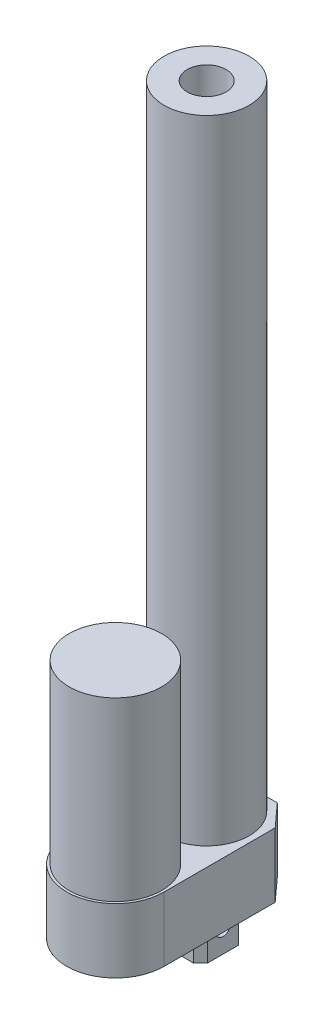
ISO-10303-21;
HEADER;
FILE_DESCRIPTION(('STEP AP214'),'2;1');
FILE_NAME('part.step','',(''),(''),'','','');
FILE_SCHEMA(('AUTOMOTIVE_DESIGN { 1 0 10303 214 1 1 1 1 }'));
ENDSEC;
DATA;
#1=APPLICATION_CONTEXT('core data for automotive mechanical design processes');
#2=APPLICATION_PROTOCOL_DEFINITION('international standard','automotive_design',2000,#1);
#3=PRODUCT_CONTEXT('',#1,'mechanical');
#4=PRODUCT('Part','Part','',(#3));
#5=PRODUCT_RELATED_PRODUCT_CATEGORY('part','',(#4));
#6=PRODUCT_DEFINITION_FORMATION('','',#4);
#7=PRODUCT_DEFINITION_CONTEXT('part definition',#1,'design');
#8=PRODUCT_DEFINITION('design','',#6,#7);
#9=PRODUCT_DEFINITION_SHAPE('','',#8);
#10=(LENGTH_UNIT() NAMED_UNIT(*) SI_UNIT(.MILLI.,.METRE.));
#11=(NAMED_UNIT(*) PLANE_ANGLE_UNIT() SI_UNIT($,.RADIAN.));
#12=(NAMED_UNIT(*) SI_UNIT($,.STERADIAN.) SOLID_ANGLE_UNIT());
#13=UNCERTAINTY_MEASURE_WITH_UNIT(LENGTH_MEASURE(1.E-05),#10,'distance_accuracy_value','');
#14=(GEOMETRIC_REPRESENTATION_CONTEXT(3) GLOBAL_UNCERTAINTY_ASSIGNED_CONTEXT((#13)) GLOBAL_UNIT_ASSIGNED_CONTEXT((#10,
#11,#12)) REPRESENTATION_CONTEXT('',''));
#15=CARTESIAN_POINT('',(0.,0.,0.));
#16=DIRECTION('',(0.,0.,1.));
#17=DIRECTION('',(1.,0.,0.));
#18=AXIS2_PLACEMENT_3D('',#15,#16,#17);
#19=CARTESIAN_POINT('',(-9.25,-9.25,-17.4999999999999));
#20=DIRECTION('',(1.,0.,0.));
#21=DIRECTION('',(0.,0.,-1.));
#22=AXIS2_PLACEMENT_3D('',#19,#20,#21);
#23=CYLINDRICAL_SURFACE('',#22,3.);
#24=CARTESIAN_POINT('',(-9.25,-9.25,-17.4999999999999));
#25=DIRECTION('',(1.,0.,0.));
#26=DIRECTION('',(0.,0.,-1.));
#27=AXIS2_PLACEMENT_3D('',#24,#25,#26);
#28=CIRCLE('',#27,3.);
#29=CARTESIAN_POINT('',(-9.25,-9.25,-20.4999999999999));
#30=VERTEX_POINT('',#29);
#31=EDGE_CURVE('E172',#30,#30,#28,.F.);
#32=ORIENTED_EDGE('',*,*,#31,.T.);
#33=EDGE_LOOP('',(#32));
#34=FACE_BOUND('',#33,.T.);
#35=CARTESIAN_POINT('',(9.25,-9.25,-17.4999999999999));
#36=DIRECTION('',(1.,0.,0.));
#37=DIRECTION('',(0.,0.,-1.));
#38=AXIS2_PLACEMENT_3D('',#35,#36,#37);
#39=CIRCLE('',#38,3.);
#40=CARTESIAN_POINT('',(9.25,-9.25,-20.4999999999999));
#41=VERTEX_POINT('',#40);
#42=EDGE_CURVE('E20',#41,#41,#39,.T.);
#43=ORIENTED_EDGE('',*,*,#42,.T.);
#44=EDGE_LOOP('',(#43));
#45=FACE_BOUND('',#44,.T.);
#46=ADVANCED_FACE('F17',(#34,#45),#23,.F.);
#47=CARTESIAN_POINT('',(0.,-18.5,0.));
#48=DIRECTION('',(0.,-1.,0.));
#49=DIRECTION('',(0.,0.,-1.));
#50=AXIS2_PLACEMENT_3D('',#47,#48,#49);
#51=PLANE('',#50);
#52=DIRECTION('',(-0.707106781186547,0.,-0.707106781186548));
#53=VECTOR('',#52,1.);
#54=CARTESIAN_POINT('',(-6.37030828551046,-18.5,-8.25));
#55=LINE('',#54,#53);
#56=CARTESIAN_POINT('',(-6.37030828551046,-18.5,-8.25));
#57=VERTEX_POINT('',#56);
#58=CARTESIAN_POINT('',(-9.25,-18.5,-11.1296917144895));
#59=VERTEX_POINT('',#58);
#60=EDGE_CURVE('E175',#57,#59,#55,.T.);
#61=ORIENTED_EDGE('',*,*,#60,.T.);
#62=DIRECTION('',(0.,0.,-1.));
#63=VECTOR('',#62,1.);
#64=CARTESIAN_POINT('',(-9.25,-18.5,-23.8703082855105));
#65=LINE('',#64,#63);
#66=CARTESIAN_POINT('',(-9.25,-18.5,-23.8703082855105));
#67=VERTEX_POINT('',#66);
#68=EDGE_CURVE('E179',#59,#67,#65,.T.);
#69=ORIENTED_EDGE('',*,*,#68,.T.);
#70=DIRECTION('',(0.707106781186551,0.,-0.707106781186544));
#71=VECTOR('',#70,1.);
#72=CARTESIAN_POINT('',(-9.25,-18.5,-23.8703082855105));
#73=LINE('',#72,#71);
#74=CARTESIAN_POINT('',(-6.37030828551044,-18.5,-26.75));
#75=VERTEX_POINT('',#74);
#76=EDGE_CURVE('E110',#67,#75,#73,.T.);
#77=ORIENTED_EDGE('',*,*,#76,.T.);
#78=DIRECTION('',(1.,0.,0.));
#79=VECTOR('',#78,1.);
#80=CARTESIAN_POINT('',(6.37030828551048,-18.5,-26.75));
#81=LINE('',#80,#79);
#82=CARTESIAN_POINT('',(6.37030828551048,-18.5,-26.75));
#83=VERTEX_POINT('',#82);
#84=EDGE_CURVE('E106',#75,#83,#81,.T.);
#85=ORIENTED_EDGE('',*,*,#84,.T.);
#86=DIRECTION('',(0.707106781186541,0.,0.707106781186554));
#87=VECTOR('',#86,1.);
#88=CARTESIAN_POINT('',(6.37030828551048,-18.5,-26.75));
#89=LINE('',#88,#87);
#90=CARTESIAN_POINT('',(9.25,-18.5,-23.8703082855104));
#91=VERTEX_POINT('',#90);
#92=EDGE_CURVE('E103',#83,#91,#89,.T.);
#93=ORIENTED_EDGE('',*,*,#92,.T.);
#94=DIRECTION('',(0.,0.,1.));
#95=VECTOR('',#94,1.);
#96=CARTESIAN_POINT('',(9.25,-18.5,-23.8703082855104));
#97=LINE('',#96,#95);
#98=CARTESIAN_POINT('',(9.25,-18.5,-11.1296917144894));
#99=VERTEX_POINT('',#98);
#100=EDGE_CURVE('E197',#91,#99,#97,.T.);
#101=ORIENTED_EDGE('',*,*,#100,.T.);
#102=DIRECTION('',(-0.707106781186551,0.,0.707106781186544));
#103=VECTOR('',#102,1.);
#104=CARTESIAN_POINT('',(9.25,-18.5,-11.1296917144894));
#105=LINE('',#104,#103);
#106=CARTESIAN_POINT('',(6.37030828551054,-18.5,-8.24999999999999));
#107=VERTEX_POINT('',#106);
#108=EDGE_CURVE('E193',#99,#107,#105,.T.);
#109=ORIENTED_EDGE('',*,*,#108,.T.);
#110=DIRECTION('',(-1.,0.,0.));
#111=VECTOR('',#110,1.);
#112=CARTESIAN_POINT('',(6.37030828551054,-18.5,-8.24999999999999));
#113=LINE('',#112,#111);
#114=EDGE_CURVE('E185',#107,#57,#113,.T.);
#115=ORIENTED_EDGE('',*,*,#114,.T.);
#116=EDGE_LOOP('',(#61,#69,#77,#85,#93,#101,#109,#115));
#117=FACE_BOUND('',#116,.T.);
#118=ADVANCED_FACE('F108',(#117),#51,.T.);
#119=CARTESIAN_POINT('',(6.37030828551048,-18.5,-26.75));
#120=DIRECTION('',(0.,0.,1.));
#121=DIRECTION('',(1.,0.,0.));
#122=AXIS2_PLACEMENT_3D('',#119,#120,#121);
#123=PLANE('',#122);
#124=DIRECTION('',(0.,1.,0.));
#125=VECTOR('',#124,1.);
#126=CARTESIAN_POINT('',(6.37030828551048,-18.5,-26.75));
#127=LINE('',#126,#125);
#128=CARTESIAN_POINT('',(6.37030828551048,0.,-26.75));
#129=VERTEX_POINT('',#128);
#130=EDGE_CURVE('E114',#129,#83,#127,.F.);
#131=ORIENTED_EDGE('',*,*,#130,.T.);
#132=ORIENTED_EDGE('',*,*,#84,.F.);
#133=DIRECTION('',(0.,1.,0.));
#134=VECTOR('',#133,1.);
#135=CARTESIAN_POINT('',(-6.37030828551044,-18.5,-26.75));
#136=LINE('',#135,#134);
#137=CARTESIAN_POINT('',(-6.37030828551044,0.,-26.75));
#138=VERTEX_POINT('',#137);
#139=EDGE_CURVE('E241',#75,#138,#136,.T.);
#140=ORIENTED_EDGE('',*,*,#139,.T.);
#141=DIRECTION('',(1.,0.,0.));
#142=VECTOR('',#141,1.);
#143=CARTESIAN_POINT('',(0.,0.,-26.75));
#144=LINE('',#143,#142);
#145=EDGE_CURVE('E121',#138,#129,#144,.T.);
#146=ORIENTED_EDGE('',*,*,#145,.T.);
#147=EDGE_LOOP('',(#131,#132,#140,#146));
#148=FACE_BOUND('',#147,.T.);
#149=ADVANCED_FACE('F118',(#148),#123,.F.);
#150=CARTESIAN_POINT('',(6.37030828551048,-18.5,-26.75));
#151=DIRECTION('',(-0.707106781186554,0.,0.707106781186541));
#152=DIRECTION('',(0.707106781186541,0.,0.707106781186554));
#153=AXIS2_PLACEMENT_3D('',#150,#151,#152);
#154=PLANE('',#153);
#155=DIRECTION('',(0.,1.,0.));
#156=VECTOR('',#155,1.);
#157=CARTESIAN_POINT('',(9.25,-18.5,-23.8703082855104));
#158=LINE('',#157,#156);
#159=CARTESIAN_POINT('',(9.25,0.,-23.8703082855104));
#160=VERTEX_POINT('',#159);
#161=EDGE_CURVE('E128',#160,#91,#158,.F.);
#162=ORIENTED_EDGE('',*,*,#161,.T.);
#163=ORIENTED_EDGE('',*,*,#92,.F.);
#164=ORIENTED_EDGE('',*,*,#130,.F.);
#165=DIRECTION('',(0.707106781186541,0.,0.707106781186553));
#166=VECTOR('',#165,1.);
#167=CARTESIAN_POINT('',(6.37030828551047,0.,-26.75));
#168=LINE('',#167,#166);
#169=EDGE_CURVE('E265',#129,#160,#168,.T.);
#170=ORIENTED_EDGE('',*,*,#169,.T.);
#171=EDGE_LOOP('',(#162,#163,#164,#170));
#172=FACE_BOUND('',#171,.T.);
#173=ADVANCED_FACE('F126',(#172),#154,.F.);
#174=CARTESIAN_POINT('',(9.25,-18.5,-23.8703082855104));
#175=DIRECTION('',(-1.,0.,0.));
#176=DIRECTION('',(0.,0.,1.));
#177=AXIS2_PLACEMENT_3D('',#174,#175,#176);
#178=PLANE('',#177);
#179=DIRECTION('',(0.,1.,0.));
#180=VECTOR('',#179,1.);
#181=CARTESIAN_POINT('',(9.25,-18.5,-11.1296917144894));
#182=LINE('',#181,#180);
#183=CARTESIAN_POINT('',(9.25,0.,-11.1296917144894));
#184=VERTEX_POINT('',#183);
#185=EDGE_CURVE('E195',#184,#99,#182,.F.);
#186=ORIENTED_EDGE('',*,*,#185,.T.);
#187=ORIENTED_EDGE('',*,*,#100,.F.);
#188=ORIENTED_EDGE('',*,*,#161,.F.);
#189=DIRECTION('',(0.,0.,1.));
#190=VECTOR('',#189,1.);
#191=CARTESIAN_POINT('',(9.25,0.,17.5));
#192=LINE('',#191,#190);
#193=EDGE_CURVE('E206',#160,#184,#192,.T.);
#194=ORIENTED_EDGE('',*,*,#193,.T.);
#195=EDGE_LOOP('',(#186,#187,#188,#194));
#196=FACE_BOUND('',#195,.T.);
#197=ORIENTED_EDGE('',*,*,#42,.F.);
#198=EDGE_LOOP('',(#197));
#199=FACE_BOUND('',#198,.T.);
#200=ADVANCED_FACE('F202',(#196,#199),#178,.F.);
#201=CARTESIAN_POINT('',(9.25,-18.5,-11.1296917144894));
#202=DIRECTION('',(-0.707106781186544,0.,-0.707106781186551));
#203=DIRECTION('',(-0.707106781186551,0.,0.707106781186544));
#204=AXIS2_PLACEMENT_3D('',#201,#202,#203);
#205=PLANE('',#204);
#206=DIRECTION('',(0.,1.,0.));
#207=VECTOR('',#206,1.);
#208=CARTESIAN_POINT('',(6.37030828551054,-18.5,-8.24999999999999));
#209=LINE('',#208,#207);
#210=CARTESIAN_POINT('',(6.37030828551054,0.,-8.24999999999999));
#211=VERTEX_POINT('',#210);
#212=EDGE_CURVE('E190',#211,#107,#209,.F.);
#213=ORIENTED_EDGE('',*,*,#212,.T.);
#214=ORIENTED_EDGE('',*,*,#108,.F.);
#215=ORIENTED_EDGE('',*,*,#185,.F.);
#216=DIRECTION('',(-0.707106781186552,0.,0.707106781186543));
#217=VECTOR('',#216,1.);
#218=CARTESIAN_POINT('',(9.25,0.,-11.1296917144894));
#219=LINE('',#218,#217);
#220=EDGE_CURVE('E214',#184,#211,#219,.T.);
#221=ORIENTED_EDGE('',*,*,#220,.T.);
#222=EDGE_LOOP('',(#213,#214,#215,#221));
#223=FACE_BOUND('',#222,.T.);
#224=ADVANCED_FACE('F210',(#223),#205,.F.);
#225=CARTESIAN_POINT('',(6.37030828551054,-18.5,-8.24999999999999));
#226=DIRECTION('',(0.,0.,-1.));
#227=DIRECTION('',(-1.,0.,0.));
#228=AXIS2_PLACEMENT_3D('',#225,#226,#227);
#229=PLANE('',#228);
#230=DIRECTION('',(0.,1.,0.));
#231=VECTOR('',#230,1.);
#232=CARTESIAN_POINT('',(-6.37030828551046,-18.5,-8.25));
#233=LINE('',#232,#231);
#234=CARTESIAN_POINT('',(-6.37030828551046,0.,-8.25));
#235=VERTEX_POINT('',#234);
#236=EDGE_CURVE('E181',#235,#57,#233,.F.);
#237=ORIENTED_EDGE('',*,*,#236,.T.);
#238=ORIENTED_EDGE('',*,*,#114,.F.);
#239=ORIENTED_EDGE('',*,*,#212,.F.);
#240=DIRECTION('',(1.,0.,0.));
#241=VECTOR('',#240,1.);
#242=CARTESIAN_POINT('',(0.,0.,-8.24999999999999));
#243=LINE('',#242,#241);
#244=EDGE_CURVE('E221',#211,#235,#243,.F.);
#245=ORIENTED_EDGE('',*,*,#244,.T.);
#246=EDGE_LOOP('',(#237,#238,#239,#245));
#247=FACE_BOUND('',#246,.T.);
#248=ADVANCED_FACE('F218',(#247),#229,.F.);
#249=CARTESIAN_POINT('',(-6.37030828551046,-18.5,-8.25));
#250=DIRECTION('',(0.707106781186548,0.,-0.707106781186547));
#251=DIRECTION('',(-0.707106781186547,0.,-0.707106781186548));
#252=AXIS2_PLACEMENT_3D('',#249,#250,#251);
#253=PLANE('',#252);
#254=DIRECTION('',(0.,1.,0.));
#255=VECTOR('',#254,1.);
#256=CARTESIAN_POINT('',(-9.25,-18.5,-11.1296917144895));
#257=LINE('',#256,#255);
#258=CARTESIAN_POINT('',(-9.25,0.,-11.1296917144895));
#259=VERTEX_POINT('',#258);
#260=EDGE_CURVE('E174',#259,#59,#257,.F.);
#261=ORIENTED_EDGE('',*,*,#260,.T.);
#262=ORIENTED_EDGE('',*,*,#60,.F.);
#263=ORIENTED_EDGE('',*,*,#236,.F.);
#264=DIRECTION('',(-0.707106781186547,0.,-0.707106781186548));
#265=VECTOR('',#264,1.);
#266=CARTESIAN_POINT('',(-6.37030828551046,0.,-8.25));
#267=LINE('',#266,#265);
#268=EDGE_CURVE('E229',#235,#259,#267,.T.);
#269=ORIENTED_EDGE('',*,*,#268,.T.);
#270=EDGE_LOOP('',(#261,#262,#263,#269));
#271=FACE_BOUND('',#270,.T.);
#272=ADVANCED_FACE('F225',(#271),#253,.F.);
#273=CARTESIAN_POINT('',(-9.25,-18.5,-23.8703082855105));
#274=DIRECTION('',(1.,0.,0.));
#275=DIRECTION('',(0.,0.,-1.));
#276=AXIS2_PLACEMENT_3D('',#273,#274,#275);
#277=PLANE('',#276);
#278=DIRECTION('',(0.,1.,0.));
#279=VECTOR('',#278,1.);
#280=CARTESIAN_POINT('',(-9.25,-18.5,-23.8703082855105));
#281=LINE('',#280,#279);
#282=CARTESIAN_POINT('',(-9.25,0.,-23.8703082855105));
#283=VERTEX_POINT('',#282);
#284=EDGE_CURVE('E237',#283,#67,#281,.F.);
#285=ORIENTED_EDGE('',*,*,#284,.T.);
#286=ORIENTED_EDGE('',*,*,#68,.F.);
#287=ORIENTED_EDGE('',*,*,#260,.F.);
#288=DIRECTION('',(0.,0.,1.));
#289=VECTOR('',#288,1.);
#290=CARTESIAN_POINT('',(-9.25,0.,17.5));
#291=LINE('',#290,#289);
#292=EDGE_CURVE('E271',#259,#283,#291,.F.);
#293=ORIENTED_EDGE('',*,*,#292,.T.);
#294=EDGE_LOOP('',(#285,#286,#287,#293));
#295=FACE_BOUND('',#294,.T.);
#296=ORIENTED_EDGE('',*,*,#31,.F.);
#297=EDGE_LOOP('',(#296));
#298=FACE_BOUND('',#297,.T.);
#299=ADVANCED_FACE('F234',(#295,#298),#277,.F.);
#300=CARTESIAN_POINT('',(-9.25,-18.5,-23.8703082855105));
#301=DIRECTION('',(0.707106781186544,0.,0.707106781186551));
#302=DIRECTION('',(0.707106781186551,0.,-0.707106781186544));
#303=AXIS2_PLACEMENT_3D('',#300,#301,#302);
#304=PLANE('',#303);
#305=ORIENTED_EDGE('',*,*,#139,.F.);
#306=ORIENTED_EDGE('',*,*,#76,.F.);
#307=ORIENTED_EDGE('',*,*,#284,.F.);
#308=DIRECTION('',(0.707106781186551,0.,-0.707106781186544));
#309=VECTOR('',#308,1.);
#310=CARTESIAN_POINT('',(-9.25,0.,-23.8703082855105));
#311=LINE('',#310,#309);
#312=EDGE_CURVE('E171',#283,#138,#311,.T.);
#313=ORIENTED_EDGE('',*,*,#312,.T.);
#314=EDGE_LOOP('',(#305,#306,#307,#313));
#315=FACE_BOUND('',#314,.T.);
#316=ADVANCED_FACE('F336',(#315),#304,.F.);
#317=CARTESIAN_POINT('',(0.,86.5,-20.));
#318=DIRECTION('',(0.,1.,0.));
#319=DIRECTION('',(0.,0.,1.));
#320=AXIS2_PLACEMENT_3D('',#317,#318,#319);
#321=PLANE('',#320);
#322=CARTESIAN_POINT('',(0.,86.5,-20.));
#323=DIRECTION('',(0.,1.,0.));
#324=DIRECTION('',(0.,0.,1.));
#325=AXIS2_PLACEMENT_3D('',#322,#323,#324);
#326=CIRCLE('',#325,8.);
#327=CARTESIAN_POINT('',(0.,86.5,-12.));
#328=VERTEX_POINT('',#327);
#329=EDGE_CURVE('E169',#328,#328,#326,.T.);
#330=ORIENTED_EDGE('',*,*,#329,.T.);
#331=EDGE_LOOP('',(#330));
#332=FACE_BOUND('',#331,.T.);
#333=ADVANCED_FACE('F327',(#332),#321,.T.);
#334=CARTESIAN_POINT('',(0.,99.,17.5));
#335=DIRECTION('',(0.,1.,0.));
#336=DIRECTION('',(0.,0.,1.));
#337=AXIS2_PLACEMENT_3D('',#334,#335,#336);
#338=PLANE('',#337);
#339=CARTESIAN_POINT('',(0.,99.,17.5));
#340=DIRECTION('',(0.,-1.,0.));
#341=DIRECTION('',(0.,0.,-1.));
#342=AXIS2_PLACEMENT_3D('',#339,#340,#341);
#343=CIRCLE('',#342,19.);
#344=CARTESIAN_POINT('',(0.,99.,-1.5));
#345=VERTEX_POINT('',#344);
#346=EDGE_CURVE('E165',#345,#345,#343,.T.);
#347=ORIENTED_EDGE('',*,*,#346,.F.);
#348=EDGE_LOOP('',(#347));
#349=FACE_BOUND('',#348,.T.);
#350=ADVANCED_FACE('F325',(#349),#338,.T.);
#351=CARTESIAN_POINT('',(0.,0.,17.5));
#352=DIRECTION('',(0.,1.,0.));
#353=DIRECTION('',(0.,0.,1.));
#354=AXIS2_PLACEMENT_3D('',#351,#352,#353);
#355=PLANE('',#354);
#356=ORIENTED_EDGE('',*,*,#292,.F.);
#357=ORIENTED_EDGE('',*,*,#268,.F.);
#358=ORIENTED_EDGE('',*,*,#244,.F.);
#359=ORIENTED_EDGE('',*,*,#220,.F.);
#360=ORIENTED_EDGE('',*,*,#193,.F.);
#361=ORIENTED_EDGE('',*,*,#169,.F.);
#362=ORIENTED_EDGE('',*,*,#145,.F.);
#363=ORIENTED_EDGE('',*,*,#312,.F.);
#364=EDGE_LOOP('',(#356,#357,#358,#359,#360,#361,#362,#363));
#365=FACE_BOUND('',#364,.T.);
#366=DIRECTION('',(1.,0.,0.));
#367=VECTOR('',#366,1.);
#368=CARTESIAN_POINT('',(11.5432004168341,0.,-37.5));
#369=LINE('',#368,#367);
#370=CARTESIAN_POINT('',(-11.5432004168341,0.,-37.5));
#371=VERTEX_POINT('',#370);
#372=CARTESIAN_POINT('',(11.5432004168341,0.,-37.5));
#373=VERTEX_POINT('',#372);
#374=EDGE_CURVE('E168',#371,#373,#369,.T.);
#375=ORIENTED_EDGE('',*,*,#374,.T.);
#376=DIRECTION('',(0.671598777527421,0.,0.740915030231992));
#377=VECTOR('',#376,1.);
#378=CARTESIAN_POINT('',(20.,0.,-28.1703672959389));
#379=LINE('',#378,#377);
#380=CARTESIAN_POINT('',(20.,0.,-28.1703672959389));
#381=VERTEX_POINT('',#380);
#382=EDGE_CURVE('E161',#373,#381,#379,.T.);
#383=ORIENTED_EDGE('',*,*,#382,.T.);
#384=DIRECTION('',(0.,0.,1.));
#385=VECTOR('',#384,1.);
#386=CARTESIAN_POINT('',(20.,0.,17.5));
#387=LINE('',#386,#385);
#388=CARTESIAN_POINT('',(20.,0.,17.5));
#389=VERTEX_POINT('',#388);
#390=EDGE_CURVE('E253',#381,#389,#387,.T.);
#391=ORIENTED_EDGE('',*,*,#390,.T.);
#392=CARTESIAN_POINT('',(0.,0.,17.5));
#393=DIRECTION('',(0.,-1.,0.));
#394=DIRECTION('',(0.,0.,-1.));
#395=AXIS2_PLACEMENT_3D('',#392,#393,#394);
#396=CIRCLE('',#395,20.);
#397=CARTESIAN_POINT('',(-20.,0.,17.5));
#398=VERTEX_POINT('',#397);
#399=EDGE_CURVE('E62',#398,#389,#396,.F.);
#400=ORIENTED_EDGE('',*,*,#399,.F.);
#401=DIRECTION('',(0.,0.,-1.));
#402=VECTOR('',#401,1.);
#403=CARTESIAN_POINT('',(-20.,0.,17.5));
#404=LINE('',#403,#402);
#405=CARTESIAN_POINT('',(-20.,0.,-28.1703672959389));
#406=VERTEX_POINT('',#405);
#407=EDGE_CURVE('E164',#398,#406,#404,.T.);
#408=ORIENTED_EDGE('',*,*,#407,.T.);
#409=DIRECTION('',(0.671598777527421,0.,-0.740915030231992));
#410=VECTOR('',#409,1.);
#411=CARTESIAN_POINT('',(-20.,0.,-28.1703672959389));
#412=LINE('',#411,#410);
#413=EDGE_CURVE('E71',#406,#371,#412,.T.);
#414=ORIENTED_EDGE('',*,*,#413,.T.);
#415=EDGE_LOOP('',(#375,#383,#391,#400,#408,#414));
#416=FACE_BOUND('',#415,.T.);
#417=ADVANCED_FACE('F296',(#365,#416),#355,.F.);
#418=CARTESIAN_POINT('',(0.,86.5,-20.));
#419=DIRECTION('',(0.,1.,0.));
#420=DIRECTION('',(0.,0.,1.));
#421=AXIS2_PLACEMENT_3D('',#418,#419,#420);
#422=CYLINDRICAL_SURFACE('',#421,8.);
#423=CARTESIAN_POINT('',(0.,286.5,-20.));
#424=DIRECTION('',(0.,1.,0.));
#425=DIRECTION('',(0.,0.,1.));
#426=AXIS2_PLACEMENT_3D('',#423,#424,#425);
#427=CIRCLE('',#426,8.);
#428=CARTESIAN_POINT('',(0.,286.5,-12.));
#429=VERTEX_POINT('',#428);
#430=EDGE_CURVE('E158',#429,#429,#427,.F.);
#431=ORIENTED_EDGE('',*,*,#430,.F.);
#432=EDGE_LOOP('',(#431));
#433=FACE_BOUND('',#432,.T.);
#434=ORIENTED_EDGE('',*,*,#329,.F.);
#435=EDGE_LOOP('',(#434));
#436=FACE_BOUND('',#435,.T.);
#437=ADVANCED_FACE('F321',(#433,#436),#422,.F.);
#438=CARTESIAN_POINT('',(0.,99.,17.5));
#439=DIRECTION('',(0.,-1.,0.));
#440=DIRECTION('',(0.,0.,-1.));
#441=AXIS2_PLACEMENT_3D('',#438,#439,#440);
#442=CYLINDRICAL_SURFACE('',#441,19.);
#443=CARTESIAN_POINT('',(0.,26.5,17.5));
#444=DIRECTION('',(0.,-1.,0.));
#445=DIRECTION('',(0.,0.,-1.));
#446=AXIS2_PLACEMENT_3D('',#443,#444,#445);
#447=CIRCLE('',#446,19.);
#448=CARTESIAN_POINT('',(0.,26.5,-1.5));
#449=VERTEX_POINT('',#448);
#450=EDGE_CURVE('E155',#449,#449,#447,.T.);
#451=ORIENTED_EDGE('',*,*,#450,.F.);
#452=EDGE_LOOP('',(#451));
#453=FACE_BOUND('',#452,.T.);
#454=ORIENTED_EDGE('',*,*,#346,.T.);
#455=EDGE_LOOP('',(#454));
#456=FACE_BOUND('',#455,.T.);
#457=ADVANCED_FACE('F318',(#453,#456),#442,.T.);
#458=CARTESIAN_POINT('',(11.5432004168341,26.5,-37.5));
#459=DIRECTION('',(0.,0.,1.));
#460=DIRECTION('',(1.,0.,0.));
#461=AXIS2_PLACEMENT_3D('',#458,#459,#460);
#462=PLANE('',#461);
#463=DIRECTION('',(0.,1.,0.));
#464=VECTOR('',#463,1.);
#465=CARTESIAN_POINT('',(-11.5432004168341,26.5,-37.5));
#466=LINE('',#465,#464);
#467=CARTESIAN_POINT('',(-11.5432004168341,26.5,-37.5));
#468=VERTEX_POINT('',#467);
#469=EDGE_CURVE('E247',#371,#468,#466,.T.);
#470=ORIENTED_EDGE('',*,*,#469,.T.);
#471=DIRECTION('',(1.,0.,0.));
#472=VECTOR('',#471,1.);
#473=CARTESIAN_POINT('',(0.,26.5,-37.5));
#474=LINE('',#473,#472);
#475=CARTESIAN_POINT('',(11.5432004168341,26.5,-37.5));
#476=VERTEX_POINT('',#475);
#477=EDGE_CURVE('E152',#476,#468,#474,.F.);
#478=ORIENTED_EDGE('',*,*,#477,.F.);
#479=DIRECTION('',(0.,1.,0.));
#480=VECTOR('',#479,1.);
#481=CARTESIAN_POINT('',(11.5432004168341,26.5,-37.5));
#482=LINE('',#481,#480);
#483=EDGE_CURVE('E260',#476,#373,#482,.F.);
#484=ORIENTED_EDGE('',*,*,#483,.T.);
#485=ORIENTED_EDGE('',*,*,#374,.F.);
#486=EDGE_LOOP('',(#470,#478,#484,#485));
#487=FACE_BOUND('',#486,.T.);
#488=ADVANCED_FACE('F293',(#487),#462,.F.);
#489=CARTESIAN_POINT('',(-20.,26.5,-28.1703672959389));
#490=DIRECTION('',(0.740915030231992,0.,0.671598777527421));
#491=DIRECTION('',(0.671598777527421,0.,-0.740915030231992));
#492=AXIS2_PLACEMENT_3D('',#489,#490,#491);
#493=PLANE('',#492);
#494=DIRECTION('',(0.,1.,0.));
#495=VECTOR('',#494,1.);
#496=CARTESIAN_POINT('',(-20.,26.5,-28.1703672959389));
#497=LINE('',#496,#495);
#498=CARTESIAN_POINT('',(-20.,26.5,-28.1703672959389));
#499=VERTEX_POINT('',#498);
#500=EDGE_CURVE('E246',#406,#499,#497,.T.);
#501=ORIENTED_EDGE('',*,*,#500,.T.);
#502=DIRECTION('',(-0.671598777527421,0.,0.740915030231992));
#503=VECTOR('',#502,1.);
#504=CARTESIAN_POINT('',(-11.5432004168341,26.5,-37.5));
#505=LINE('',#504,#503);
#506=EDGE_CURVE('E149',#468,#499,#505,.T.);
#507=ORIENTED_EDGE('',*,*,#506,.F.);
#508=ORIENTED_EDGE('',*,*,#469,.F.);
#509=ORIENTED_EDGE('',*,*,#413,.F.);
#510=EDGE_LOOP('',(#501,#507,#508,#509));
#511=FACE_BOUND('',#510,.T.);
#512=ADVANCED_FACE('F307',(#511),#493,.F.);
#513=CARTESIAN_POINT('',(-20.,26.5,17.5));
#514=DIRECTION('',(1.,0.,0.));
#515=DIRECTION('',(0.,0.,-1.));
#516=AXIS2_PLACEMENT_3D('',#513,#514,#515);
#517=PLANE('',#516);
#518=DIRECTION('',(0.,-1.,0.));
#519=VECTOR('',#518,1.);
#520=CARTESIAN_POINT('',(-20.,26.5,17.5));
#521=LINE('',#520,#519);
#522=CARTESIAN_POINT('',(-20.,26.5,17.5));
#523=VERTEX_POINT('',#522);
#524=EDGE_CURVE('E163',#523,#398,#521,.T.);
#525=ORIENTED_EDGE('',*,*,#524,.F.);
#526=DIRECTION('',(0.,0.,1.));
#527=VECTOR('',#526,1.);
#528=CARTESIAN_POINT('',(-20.,26.5,17.5));
#529=LINE('',#528,#527);
#530=EDGE_CURVE('E146',#499,#523,#529,.T.);
#531=ORIENTED_EDGE('',*,*,#530,.F.);
#532=ORIENTED_EDGE('',*,*,#500,.F.);
#533=ORIENTED_EDGE('',*,*,#407,.F.);
#534=EDGE_LOOP('',(#525,#531,#532,#533));
#535=FACE_BOUND('',#534,.T.);
#536=ADVANCED_FACE('F304',(#535),#517,.F.);
#537=CARTESIAN_POINT('',(0.,26.5,17.5));
#538=DIRECTION('',(0.,-1.,0.));
#539=DIRECTION('',(0.,0.,-1.));
#540=AXIS2_PLACEMENT_3D('',#537,#538,#539);
#541=CYLINDRICAL_SURFACE('',#540,20.);
#542=CARTESIAN_POINT('',(0.,26.5,17.5));
#543=DIRECTION('',(0.,-1.,0.));
#544=DIRECTION('',(0.,0.,-1.));
#545=AXIS2_PLACEMENT_3D('',#542,#543,#544);
#546=CIRCLE('',#545,20.);
#547=CARTESIAN_POINT('',(20.,26.5,17.5));
#548=VERTEX_POINT('',#547);
#549=EDGE_CURVE('E143',#523,#548,#546,.F.);
#550=ORIENTED_EDGE('',*,*,#549,.F.);
#551=ORIENTED_EDGE('',*,*,#524,.T.);
#552=ORIENTED_EDGE('',*,*,#399,.T.);
#553=DIRECTION('',(0.,1.,0.));
#554=VECTOR('',#553,1.);
#555=CARTESIAN_POINT('',(20.,26.5,17.5));
#556=LINE('',#555,#554);
#557=EDGE_CURVE('E255',#389,#548,#556,.T.);
#558=ORIENTED_EDGE('',*,*,#557,.T.);
#559=EDGE_LOOP('',(#550,#551,#552,#558));
#560=FACE_BOUND('',#559,.T.);
#561=ADVANCED_FACE('F301',(#560),#541,.T.);
#562=CARTESIAN_POINT('',(20.,26.5,17.5));
#563=DIRECTION('',(-1.,0.,0.));
#564=DIRECTION('',(0.,0.,1.));
#565=AXIS2_PLACEMENT_3D('',#562,#563,#564);
#566=PLANE('',#565);
#567=DIRECTION('',(0.,1.,0.));
#568=VECTOR('',#567,1.);
#569=CARTESIAN_POINT('',(20.,26.5,-28.1703672959389));
#570=LINE('',#569,#568);
#571=CARTESIAN_POINT('',(20.,26.5,-28.1703672959389));
#572=VERTEX_POINT('',#571);
#573=EDGE_CURVE('E35',#381,#572,#570,.T.);
#574=ORIENTED_EDGE('',*,*,#573,.T.);
#575=DIRECTION('',(0.,0.,1.));
#576=VECTOR('',#575,1.);
#577=CARTESIAN_POINT('',(20.,26.5,17.5));
#578=LINE('',#577,#576);
#579=EDGE_CURVE('E140',#548,#572,#578,.F.);
#580=ORIENTED_EDGE('',*,*,#579,.F.);
#581=ORIENTED_EDGE('',*,*,#557,.F.);
#582=ORIENTED_EDGE('',*,*,#390,.F.);
#583=EDGE_LOOP('',(#574,#580,#581,#582));
#584=FACE_BOUND('',#583,.T.);
#585=ADVANCED_FACE('F298',(#584),#566,.F.);
#586=CARTESIAN_POINT('',(20.,26.5,-28.1703672959389));
#587=DIRECTION('',(-0.740915030231992,0.,0.671598777527421));
#588=DIRECTION('',(0.671598777527421,0.,0.740915030231992));
#589=AXIS2_PLACEMENT_3D('',#586,#587,#588);
#590=PLANE('',#589);
#591=ORIENTED_EDGE('',*,*,#483,.F.);
#592=DIRECTION('',(-0.671598777527421,0.,-0.740915030231992));
#593=VECTOR('',#592,1.);
#594=CARTESIAN_POINT('',(20.,26.5,-28.1703672959389));
#595=LINE('',#594,#593);
#596=EDGE_CURVE('E137',#572,#476,#595,.T.);
#597=ORIENTED_EDGE('',*,*,#596,.F.);
#598=ORIENTED_EDGE('',*,*,#573,.F.);
#599=ORIENTED_EDGE('',*,*,#382,.F.);
#600=EDGE_LOOP('',(#591,#597,#598,#599));
#601=FACE_BOUND('',#600,.T.);
#602=ADVANCED_FACE('F295',(#601),#590,.F.);
#603=CARTESIAN_POINT('',(0.,286.5,-20.));
#604=DIRECTION('',(0.,1.,0.));
#605=DIRECTION('',(0.,0.,1.));
#606=AXIS2_PLACEMENT_3D('',#603,#604,#605);
#607=PLANE('',#606);
#608=CARTESIAN_POINT('',(0.,286.5,-20.));
#609=DIRECTION('',(0.,-1.,0.));
#610=DIRECTION('',(0.,0.,-1.));
#611=AXIS2_PLACEMENT_3D('',#608,#609,#610);
#612=CIRCLE('',#611,17.5);
#613=CARTESIAN_POINT('',(0.,286.5,-37.5));
#614=VERTEX_POINT('',#613);
#615=EDGE_CURVE('E26',#614,#614,#612,.T.);
#616=ORIENTED_EDGE('',*,*,#615,.F.);
#617=EDGE_LOOP('',(#616));
#618=FACE_BOUND('',#617,.T.);
#619=ORIENTED_EDGE('',*,*,#430,.T.);
#620=EDGE_LOOP('',(#619));
#621=FACE_BOUND('',#620,.T.);
#622=ADVANCED_FACE('F313',(#618,#621),#607,.T.);
#623=CARTESIAN_POINT('',(0.,26.5,17.5));
#624=DIRECTION('',(0.,1.,0.));
#625=DIRECTION('',(0.,0.,1.));
#626=AXIS2_PLACEMENT_3D('',#623,#624,#625);
#627=PLANE('',#626);
#628=CARTESIAN_POINT('',(0.,26.5,-20.));
#629=DIRECTION('',(0.,-1.,0.));
#630=DIRECTION('',(0.,0.,-1.));
#631=AXIS2_PLACEMENT_3D('',#628,#629,#630);
#632=CIRCLE('',#631,17.5);
#633=CARTESIAN_POINT('',(0.,26.5,-37.5));
#634=VERTEX_POINT('',#633);
#635=EDGE_CURVE('E11',#634,#634,#632,.F.);
#636=ORIENTED_EDGE('',*,*,#635,.F.);
#637=EDGE_LOOP('',(#636));
#638=FACE_BOUND('',#637,.T.);
#639=ORIENTED_EDGE('',*,*,#579,.T.);
#640=ORIENTED_EDGE('',*,*,#596,.T.);
#641=ORIENTED_EDGE('',*,*,#477,.T.);
#642=ORIENTED_EDGE('',*,*,#506,.T.);
#643=ORIENTED_EDGE('',*,*,#530,.T.);
#644=ORIENTED_EDGE('',*,*,#549,.T.);
#645=EDGE_LOOP('',(#639,#640,#641,#642,#643,#644));
#646=FACE_BOUND('',#645,.T.);
#647=ORIENTED_EDGE('',*,*,#450,.T.);
#648=EDGE_LOOP('',(#647));
#649=FACE_BOUND('',#648,.T.);
#650=ADVANCED_FACE('F309',(#638,#646,#649),#627,.T.);
#651=CARTESIAN_POINT('',(0.,286.5,-20.));
#652=DIRECTION('',(0.,-1.,0.));
#653=DIRECTION('',(0.,0.,-1.));
#654=AXIS2_PLACEMENT_3D('',#651,#652,#653);
#655=CYLINDRICAL_SURFACE('',#654,17.5);
#656=ORIENTED_EDGE('',*,*,#635,.T.);
#657=EDGE_LOOP('',(#656));
#658=FACE_BOUND('',#657,.T.);
#659=ORIENTED_EDGE('',*,*,#615,.T.);
#660=EDGE_LOOP('',(#659));
#661=FACE_BOUND('',#660,.T.);
#662=ADVANCED_FACE('F312',(#658,#661),#655,.T.);
#663=CLOSED_SHELL('',(#46,#118,#149,#173,#200,#224,#248,#272,#299,#316,#333,#350,#417,#437,#457,
#488,#512,#536,#561,#585,#602,#622,#650,#662));
#664=MANIFOLD_SOLID_BREP('B1',#663);
#665=ADVANCED_BREP_SHAPE_REPRESENTATION('',(#18,#664),#14);
#666=SHAPE_DEFINITION_REPRESENTATION(#9,#665);
ENDSEC;
END-ISO-10303-21;
